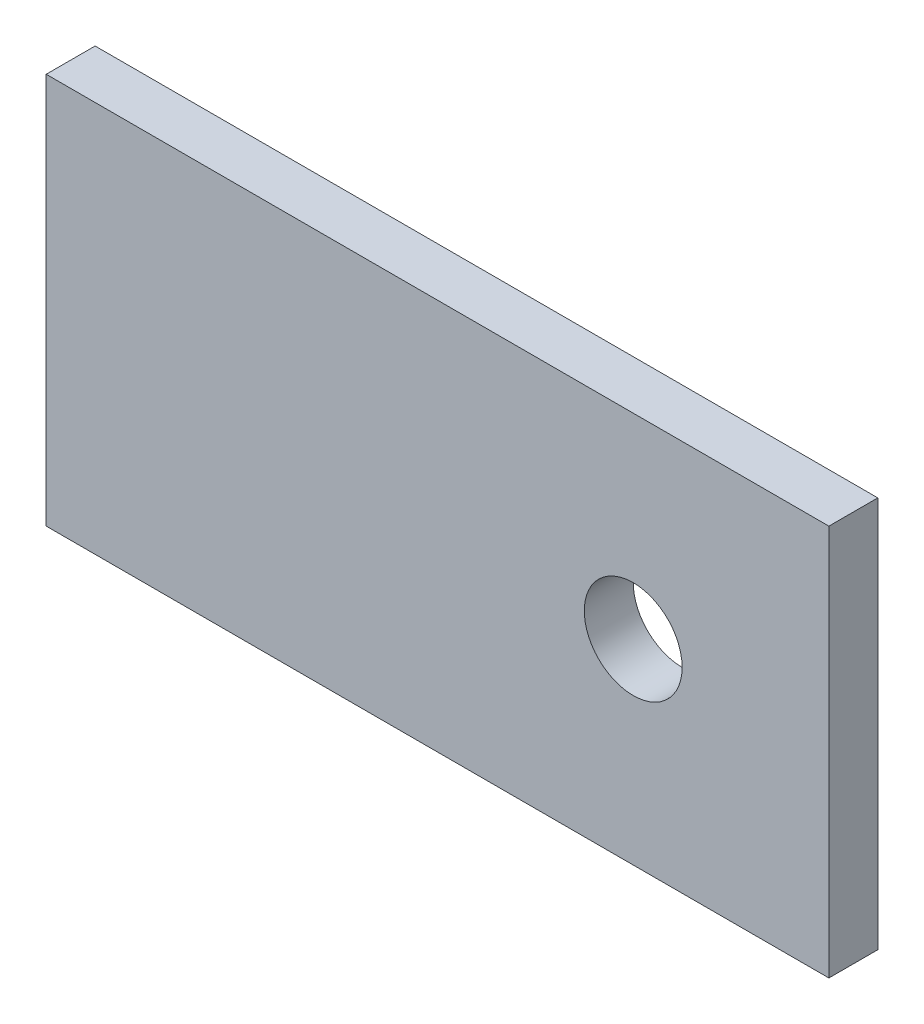
ISO-10303-21;
HEADER;
FILE_DESCRIPTION(('STEP AP214'),'2;1');
FILE_NAME('part.step','',(''),(''),'','','');
FILE_SCHEMA(('AUTOMOTIVE_DESIGN { 1 0 10303 214 1 1 1 1 }'));
ENDSEC;
DATA;
#1=APPLICATION_CONTEXT('core data for automotive mechanical design processes');
#2=APPLICATION_PROTOCOL_DEFINITION('international standard','automotive_design',2000,#1);
#3=PRODUCT_CONTEXT('',#1,'mechanical');
#4=PRODUCT('Part','Part','',(#3));
#5=PRODUCT_RELATED_PRODUCT_CATEGORY('part','',(#4));
#6=PRODUCT_DEFINITION_FORMATION('','',#4);
#7=PRODUCT_DEFINITION_CONTEXT('part definition',#1,'design');
#8=PRODUCT_DEFINITION('design','',#6,#7);
#9=PRODUCT_DEFINITION_SHAPE('','',#8);
#10=(LENGTH_UNIT() NAMED_UNIT(*) SI_UNIT(.MILLI.,.METRE.));
#11=(NAMED_UNIT(*) PLANE_ANGLE_UNIT() SI_UNIT($,.RADIAN.));
#12=(NAMED_UNIT(*) SI_UNIT($,.STERADIAN.) SOLID_ANGLE_UNIT());
#13=UNCERTAINTY_MEASURE_WITH_UNIT(LENGTH_MEASURE(1.E-05),#10,'distance_accuracy_value','');
#14=(GEOMETRIC_REPRESENTATION_CONTEXT(3) GLOBAL_UNCERTAINTY_ASSIGNED_CONTEXT((#13)) GLOBAL_UNIT_ASSIGNED_CONTEXT((#10,
#11,#12)) REPRESENTATION_CONTEXT('',''));
#15=CARTESIAN_POINT('',(0.,0.,0.));
#16=DIRECTION('',(0.,0.,1.));
#17=DIRECTION('',(1.,0.,0.));
#18=AXIS2_PLACEMENT_3D('',#15,#16,#17);
#19=CARTESIAN_POINT('',(0.,0.,3.175));
#20=DIRECTION('',(0.,0.,1.));
#21=DIRECTION('',(1.,0.,0.));
#22=AXIS2_PLACEMENT_3D('',#19,#20,#21);
#23=PLANE('',#22);
#24=DIRECTION('',(0.,-1.,0.));
#25=VECTOR('',#24,1.);
#26=CARTESIAN_POINT('',(-38.1,12.7,3.175));
#27=LINE('',#26,#25);
#28=CARTESIAN_POINT('',(-38.1,12.7,3.175));
#29=VERTEX_POINT('',#28);
#30=CARTESIAN_POINT('',(-38.1,-12.7,3.175));
#31=VERTEX_POINT('',#30);
#32=EDGE_CURVE('E85',#29,#31,#27,.T.);
#33=ORIENTED_EDGE('',*,*,#32,.T.);
#34=DIRECTION('',(1.,0.,0.));
#35=VECTOR('',#34,1.);
#36=CARTESIAN_POINT('',(-38.1,-12.7,3.175));
#37=LINE('',#36,#35);
#38=CARTESIAN_POINT('',(12.7,-12.7,3.175));
#39=VERTEX_POINT('',#38);
#40=EDGE_CURVE('E80',#31,#39,#37,.T.);
#41=ORIENTED_EDGE('',*,*,#40,.T.);
#42=DIRECTION('',(0.,1.,0.));
#43=VECTOR('',#42,1.);
#44=CARTESIAN_POINT('',(12.7,12.7,3.175));
#45=LINE('',#44,#43);
#46=CARTESIAN_POINT('',(12.7,12.7,3.175));
#47=VERTEX_POINT('',#46);
#48=EDGE_CURVE('E83',#39,#47,#45,.T.);
#49=ORIENTED_EDGE('',*,*,#48,.T.);
#50=DIRECTION('',(-1.,0.,0.));
#51=VECTOR('',#50,1.);
#52=CARTESIAN_POINT('',(-38.1,12.7,3.175));
#53=LINE('',#52,#51);
#54=EDGE_CURVE('E50',#47,#29,#53,.T.);
#55=ORIENTED_EDGE('',*,*,#54,.T.);
#56=EDGE_LOOP('',(#33,#41,#49,#55));
#57=FACE_BOUND('',#56,.T.);
#58=CARTESIAN_POINT('',(0.,0.,3.175));
#59=DIRECTION('',(0.,0.,1.));
#60=DIRECTION('',(1.,0.,0.));
#61=AXIS2_PLACEMENT_3D('',#58,#59,#60);
#62=CIRCLE('',#61,3.175);
#63=CARTESIAN_POINT('',(3.175,0.,3.175));
#64=VERTEX_POINT('',#63);
#65=EDGE_CURVE('E100',#64,#64,#62,.T.);
#66=ORIENTED_EDGE('',*,*,#65,.F.);
#67=EDGE_LOOP('',(#66));
#68=FACE_BOUND('',#67,.T.);
#69=ADVANCED_FACE('F33',(#57,#68),#23,.T.);
#70=CARTESIAN_POINT('',(0.,0.,0.));
#71=DIRECTION('',(0.,0.,1.));
#72=DIRECTION('',(1.,0.,0.));
#73=AXIS2_PLACEMENT_3D('',#70,#71,#72);
#74=PLANE('',#73);
#75=DIRECTION('',(0.,-1.,0.));
#76=VECTOR('',#75,1.);
#77=CARTESIAN_POINT('',(-38.1,12.7,0.));
#78=LINE('',#77,#76);
#79=CARTESIAN_POINT('',(-38.1,12.7,0.));
#80=VERTEX_POINT('',#79);
#81=CARTESIAN_POINT('',(-38.1,-12.7,0.));
#82=VERTEX_POINT('',#81);
#83=EDGE_CURVE('E97',#80,#82,#78,.T.);
#84=ORIENTED_EDGE('',*,*,#83,.F.);
#85=DIRECTION('',(-1.,0.,0.));
#86=VECTOR('',#85,1.);
#87=CARTESIAN_POINT('',(-38.1,12.7,0.));
#88=LINE('',#87,#86);
#89=CARTESIAN_POINT('',(12.7,12.7,0.));
#90=VERTEX_POINT('',#89);
#91=EDGE_CURVE('E73',#90,#80,#88,.T.);
#92=ORIENTED_EDGE('',*,*,#91,.F.);
#93=DIRECTION('',(0.,1.,0.));
#94=VECTOR('',#93,1.);
#95=CARTESIAN_POINT('',(12.7,12.7,0.));
#96=LINE('',#95,#94);
#97=CARTESIAN_POINT('',(12.7,-12.7,0.));
#98=VERTEX_POINT('',#97);
#99=EDGE_CURVE('E67',#98,#90,#96,.T.);
#100=ORIENTED_EDGE('',*,*,#99,.F.);
#101=DIRECTION('',(1.,0.,0.));
#102=VECTOR('',#101,1.);
#103=CARTESIAN_POINT('',(-38.1,-12.7,0.));
#104=LINE('',#103,#102);
#105=EDGE_CURVE('E89',#82,#98,#104,.T.);
#106=ORIENTED_EDGE('',*,*,#105,.F.);
#107=EDGE_LOOP('',(#84,#92,#100,#106));
#108=FACE_BOUND('',#107,.T.);
#109=CARTESIAN_POINT('',(0.,0.,0.));
#110=DIRECTION('',(0.,0.,1.));
#111=DIRECTION('',(1.,0.,0.));
#112=AXIS2_PLACEMENT_3D('',#109,#110,#111);
#113=CIRCLE('',#112,3.175);
#114=CARTESIAN_POINT('',(3.175,0.,0.));
#115=VERTEX_POINT('',#114);
#116=EDGE_CURVE('E112',#115,#115,#113,.T.);
#117=ORIENTED_EDGE('',*,*,#116,.T.);
#118=EDGE_LOOP('',(#117));
#119=FACE_BOUND('',#118,.T.);
#120=ADVANCED_FACE('F108',(#108,#119),#74,.F.);
#121=CARTESIAN_POINT('',(-38.1,12.7,3.175));
#122=DIRECTION('',(1.,0.,0.));
#123=DIRECTION('',(0.,0.,-1.));
#124=AXIS2_PLACEMENT_3D('',#121,#122,#123);
#125=PLANE('',#124);
#126=ORIENTED_EDGE('',*,*,#83,.T.);
#127=DIRECTION('',(0.,0.,-1.));
#128=VECTOR('',#127,1.);
#129=CARTESIAN_POINT('',(-38.1,-12.7,3.175));
#130=LINE('',#129,#128);
#131=EDGE_CURVE('E11',#31,#82,#130,.T.);
#132=ORIENTED_EDGE('',*,*,#131,.F.);
#133=ORIENTED_EDGE('',*,*,#32,.F.);
#134=DIRECTION('',(0.,0.,-1.));
#135=VECTOR('',#134,1.);
#136=CARTESIAN_POINT('',(-38.1,12.7,3.175));
#137=LINE('',#136,#135);
#138=EDGE_CURVE('E93',#29,#80,#137,.T.);
#139=ORIENTED_EDGE('',*,*,#138,.T.);
#140=EDGE_LOOP('',(#126,#132,#133,#139));
#141=FACE_BOUND('',#140,.T.);
#142=ADVANCED_FACE('F35',(#141),#125,.F.);
#143=CARTESIAN_POINT('',(-38.1,-12.7,3.175));
#144=DIRECTION('',(0.,1.,0.));
#145=DIRECTION('',(0.,0.,1.));
#146=AXIS2_PLACEMENT_3D('',#143,#144,#145);
#147=PLANE('',#146);
#148=ORIENTED_EDGE('',*,*,#105,.T.);
#149=DIRECTION('',(0.,0.,-1.));
#150=VECTOR('',#149,1.);
#151=CARTESIAN_POINT('',(12.7,-12.7,3.175));
#152=LINE('',#151,#150);
#153=EDGE_CURVE('E42',#39,#98,#152,.T.);
#154=ORIENTED_EDGE('',*,*,#153,.F.);
#155=ORIENTED_EDGE('',*,*,#40,.F.);
#156=ORIENTED_EDGE('',*,*,#131,.T.);
#157=EDGE_LOOP('',(#148,#154,#155,#156));
#158=FACE_BOUND('',#157,.T.);
#159=ADVANCED_FACE('F88',(#158),#147,.F.);
#160=CARTESIAN_POINT('',(12.7,12.7,3.175));
#161=DIRECTION('',(-1.,0.,0.));
#162=DIRECTION('',(0.,-1.,0.));
#163=AXIS2_PLACEMENT_3D('',#160,#161,#162);
#164=PLANE('',#163);
#165=ORIENTED_EDGE('',*,*,#99,.T.);
#166=DIRECTION('',(0.,0.,-1.));
#167=VECTOR('',#166,1.);
#168=CARTESIAN_POINT('',(12.7,12.7,3.175));
#169=LINE('',#168,#167);
#170=EDGE_CURVE('E90',#47,#90,#169,.T.);
#171=ORIENTED_EDGE('',*,*,#170,.F.);
#172=ORIENTED_EDGE('',*,*,#48,.F.);
#173=ORIENTED_EDGE('',*,*,#153,.T.);
#174=EDGE_LOOP('',(#165,#171,#172,#173));
#175=FACE_BOUND('',#174,.T.);
#176=ADVANCED_FACE('F91',(#175),#164,.F.);
#177=CARTESIAN_POINT('',(-38.1,12.7,3.175));
#178=DIRECTION('',(0.,-1.,0.));
#179=DIRECTION('',(0.,0.,-1.));
#180=AXIS2_PLACEMENT_3D('',#177,#178,#179);
#181=PLANE('',#180);
#182=ORIENTED_EDGE('',*,*,#91,.T.);
#183=ORIENTED_EDGE('',*,*,#138,.F.);
#184=ORIENTED_EDGE('',*,*,#54,.F.);
#185=ORIENTED_EDGE('',*,*,#170,.T.);
#186=EDGE_LOOP('',(#182,#183,#184,#185));
#187=FACE_BOUND('',#186,.T.);
#188=ADVANCED_FACE('F105',(#187),#181,.F.);
#189=CARTESIAN_POINT('',(0.,0.,3.175));
#190=DIRECTION('',(0.,0.,-1.));
#191=DIRECTION('',(-1.,0.,0.));
#192=AXIS2_PLACEMENT_3D('',#189,#190,#191);
#193=CYLINDRICAL_SURFACE('',#192,3.175);
#194=ORIENTED_EDGE('',*,*,#65,.T.);
#195=EDGE_LOOP('',(#194));
#196=FACE_BOUND('',#195,.T.);
#197=ORIENTED_EDGE('',*,*,#116,.F.);
#198=EDGE_LOOP('',(#197));
#199=FACE_BOUND('',#198,.T.);
#200=ADVANCED_FACE('F118',(#196,#199),#193,.F.);
#201=CLOSED_SHELL('',(#69,#120,#142,#159,#176,#188,#200));
#202=MANIFOLD_SOLID_BREP('B2',#201);
#203=ADVANCED_BREP_SHAPE_REPRESENTATION('',(#18,#202),#14);
#204=SHAPE_DEFINITION_REPRESENTATION(#9,#203);
ENDSEC;
END-ISO-10303-21;
